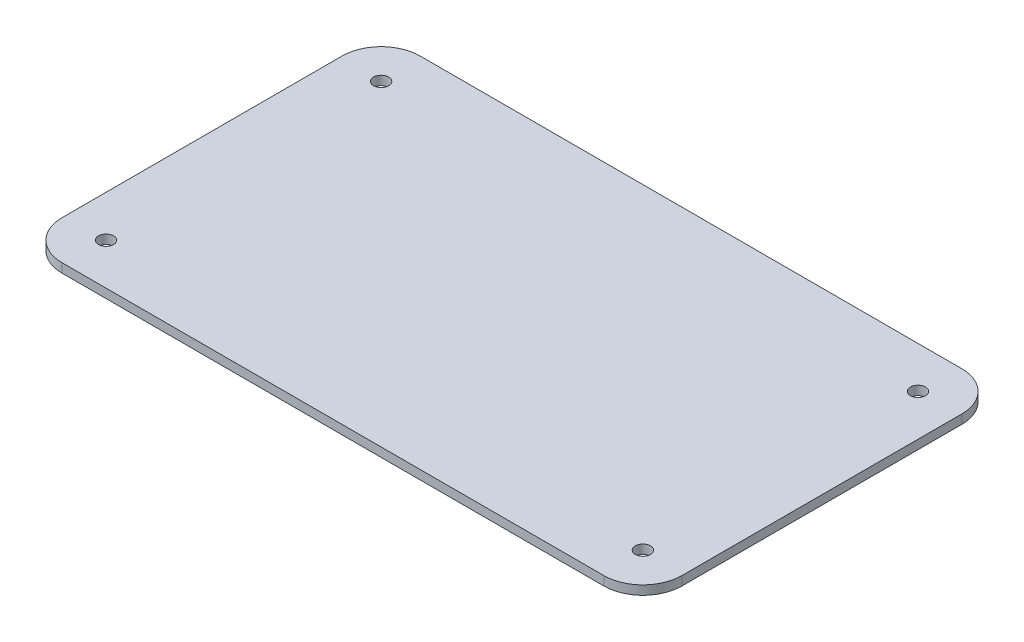
ISO-10303-21;
HEADER;
FILE_DESCRIPTION(('STEP AP214'),'2;1');
FILE_NAME('part.step','',(''),(''),'','','');
FILE_SCHEMA(('AUTOMOTIVE_DESIGN { 1 0 10303 214 1 1 1 1 }'));
ENDSEC;
DATA;
#1=APPLICATION_CONTEXT('core data for automotive mechanical design processes');
#2=APPLICATION_PROTOCOL_DEFINITION('international standard','automotive_design',2000,#1);
#3=PRODUCT_CONTEXT('',#1,'mechanical');
#4=PRODUCT('Part','Part','',(#3));
#5=PRODUCT_RELATED_PRODUCT_CATEGORY('part','',(#4));
#6=PRODUCT_DEFINITION_FORMATION('','',#4);
#7=PRODUCT_DEFINITION_CONTEXT('part definition',#1,'design');
#8=PRODUCT_DEFINITION('design','',#6,#7);
#9=PRODUCT_DEFINITION_SHAPE('','',#8);
#10=(LENGTH_UNIT() NAMED_UNIT(*) SI_UNIT(.MILLI.,.METRE.));
#11=(NAMED_UNIT(*) PLANE_ANGLE_UNIT() SI_UNIT($,.RADIAN.));
#12=(NAMED_UNIT(*) SI_UNIT($,.STERADIAN.) SOLID_ANGLE_UNIT());
#13=UNCERTAINTY_MEASURE_WITH_UNIT(LENGTH_MEASURE(1.E-05),#10,'distance_accuracy_value','');
#14=(GEOMETRIC_REPRESENTATION_CONTEXT(3) GLOBAL_UNCERTAINTY_ASSIGNED_CONTEXT((#13)) GLOBAL_UNIT_ASSIGNED_CONTEXT((#10,
#11,#12)) REPRESENTATION_CONTEXT('',''));
#15=CARTESIAN_POINT('',(0.,0.,0.));
#16=DIRECTION('',(0.,0.,1.));
#17=DIRECTION('',(1.,0.,0.));
#18=AXIS2_PLACEMENT_3D('',#15,#16,#17);
#19=CARTESIAN_POINT('',(89.7500000000001,3.,-46.385));
#20=DIRECTION('',(0.,-1.,0.));
#21=DIRECTION('',(0.,0.,-1.));
#22=AXIS2_PLACEMENT_3D('',#19,#20,#21);
#23=PLANE('',#22);
#24=CARTESIAN_POINT('',(89.7500000000001,3.,-46.385));
#25=DIRECTION('',(0.,1.,0.));
#26=DIRECTION('',(0.,0.,-1.));
#27=AXIS2_PLACEMENT_3D('',#24,#25,#26);
#28=CIRCLE('',#27,12.94);
#29=CARTESIAN_POINT('',(102.69,3.,-46.3849999999999));
#30=VERTEX_POINT('',#29);
#31=CARTESIAN_POINT('',(89.75,3.,-59.325));
#32=VERTEX_POINT('',#31);
#33=EDGE_CURVE('E164',#30,#32,#28,.T.);
#34=ORIENTED_EDGE('',*,*,#33,.T.);
#35=DIRECTION('',(-1.,0.,0.));
#36=VECTOR('',#35,1.);
#37=CARTESIAN_POINT('',(-89.7499999999999,3.,-59.325));
#38=LINE('',#37,#36);
#39=CARTESIAN_POINT('',(-89.7499999999999,3.,-59.325));
#40=VERTEX_POINT('',#39);
#41=EDGE_CURVE('E100',#32,#40,#38,.T.);
#42=ORIENTED_EDGE('',*,*,#41,.T.);
#43=CARTESIAN_POINT('',(-89.75,3.,-46.385));
#44=DIRECTION('',(0.,1.,0.));
#45=DIRECTION('',(0.,0.,-1.));
#46=AXIS2_PLACEMENT_3D('',#43,#44,#45);
#47=CIRCLE('',#46,12.94);
#48=CARTESIAN_POINT('',(-102.69,3.,-46.3849999999999));
#49=VERTEX_POINT('',#48);
#50=EDGE_CURVE('E185',#40,#49,#47,.T.);
#51=ORIENTED_EDGE('',*,*,#50,.T.);
#52=DIRECTION('',(0.,0.,1.));
#53=VECTOR('',#52,1.);
#54=CARTESIAN_POINT('',(-102.69,3.,46.3849999999999));
#55=LINE('',#54,#53);
#56=CARTESIAN_POINT('',(-102.69,3.,46.3849999999999));
#57=VERTEX_POINT('',#56);
#58=EDGE_CURVE('E199',#49,#57,#55,.T.);
#59=ORIENTED_EDGE('',*,*,#58,.T.);
#60=CARTESIAN_POINT('',(-89.75,3.,46.385));
#61=DIRECTION('',(0.,1.,0.));
#62=DIRECTION('',(0.,0.,-1.));
#63=AXIS2_PLACEMENT_3D('',#60,#61,#62);
#64=CIRCLE('',#63,12.94);
#65=CARTESIAN_POINT('',(-89.7499999999999,3.,59.325));
#66=VERTEX_POINT('',#65);
#67=EDGE_CURVE('E119',#57,#66,#64,.T.);
#68=ORIENTED_EDGE('',*,*,#67,.T.);
#69=DIRECTION('',(1.,0.,0.));
#70=VECTOR('',#69,1.);
#71=CARTESIAN_POINT('',(-89.7499999999999,3.,59.325));
#72=LINE('',#71,#70);
#73=CARTESIAN_POINT('',(89.75,3.,59.325));
#74=VERTEX_POINT('',#73);
#75=EDGE_CURVE('E113',#66,#74,#72,.T.);
#76=ORIENTED_EDGE('',*,*,#75,.T.);
#77=CARTESIAN_POINT('',(89.7500000000001,3.,46.385));
#78=DIRECTION('',(0.,1.,0.));
#79=DIRECTION('',(0.,0.,1.));
#80=AXIS2_PLACEMENT_3D('',#77,#78,#79);
#81=CIRCLE('',#80,12.94);
#82=CARTESIAN_POINT('',(102.69,3.,46.3849999999999));
#83=VERTEX_POINT('',#82);
#84=EDGE_CURVE('E117',#74,#83,#81,.T.);
#85=ORIENTED_EDGE('',*,*,#84,.T.);
#86=DIRECTION('',(0.,0.,-1.));
#87=VECTOR('',#86,1.);
#88=CARTESIAN_POINT('',(102.69,3.,46.3849999999999));
#89=LINE('',#88,#87);
#90=EDGE_CURVE('E57',#83,#30,#89,.T.);
#91=ORIENTED_EDGE('',*,*,#90,.T.);
#92=EDGE_LOOP('',(#34,#42,#51,#59,#68,#76,#85,#91));
#93=FACE_BOUND('',#92,.T.);
#94=CARTESIAN_POINT('',(-88.94,3.,-45.575));
#95=DIRECTION('',(0.,1.,0.));
#96=DIRECTION('',(0.,0.,1.));
#97=AXIS2_PLACEMENT_3D('',#94,#95,#96);
#98=CIRCLE('',#97,2.5);
#99=CARTESIAN_POINT('',(-88.94,3.,-43.075));
#100=VERTEX_POINT('',#99);
#101=EDGE_CURVE('E146',#100,#100,#98,.T.);
#102=ORIENTED_EDGE('',*,*,#101,.F.);
#103=EDGE_LOOP('',(#102));
#104=FACE_BOUND('',#103,.T.);
#105=CARTESIAN_POINT('',(88.94,3.,-45.575));
#106=DIRECTION('',(0.,1.,0.));
#107=DIRECTION('',(0.,0.,-1.));
#108=AXIS2_PLACEMENT_3D('',#105,#106,#107);
#109=CIRCLE('',#108,2.5);
#110=CARTESIAN_POINT('',(88.94,3.,-48.075));
#111=VERTEX_POINT('',#110);
#112=EDGE_CURVE('E213',#111,#111,#109,.T.);
#113=ORIENTED_EDGE('',*,*,#112,.F.);
#114=EDGE_LOOP('',(#113));
#115=FACE_BOUND('',#114,.T.);
#116=CARTESIAN_POINT('',(88.94,3.,45.575));
#117=DIRECTION('',(0.,1.,0.));
#118=DIRECTION('',(0.,0.,1.));
#119=AXIS2_PLACEMENT_3D('',#116,#117,#118);
#120=CIRCLE('',#119,2.5);
#121=CARTESIAN_POINT('',(88.94,3.,48.075));
#122=VERTEX_POINT('',#121);
#123=EDGE_CURVE('E221',#122,#122,#120,.T.);
#124=ORIENTED_EDGE('',*,*,#123,.F.);
#125=EDGE_LOOP('',(#124));
#126=FACE_BOUND('',#125,.T.);
#127=CARTESIAN_POINT('',(-88.94,3.,45.575));
#128=DIRECTION('',(0.,1.,0.));
#129=DIRECTION('',(0.,0.,-1.));
#130=AXIS2_PLACEMENT_3D('',#127,#128,#129);
#131=CIRCLE('',#130,2.5);
#132=CARTESIAN_POINT('',(-88.94,3.,43.075));
#133=VERTEX_POINT('',#132);
#134=EDGE_CURVE('E229',#133,#133,#131,.T.);
#135=ORIENTED_EDGE('',*,*,#134,.F.);
#136=EDGE_LOOP('',(#135));
#137=FACE_BOUND('',#136,.T.);
#138=ADVANCED_FACE('F39',(#93,#104,#115,#126,#137),#23,.F.);
#139=CARTESIAN_POINT('',(89.7500000000001,0.,-46.385));
#140=DIRECTION('',(0.,-1.,0.));
#141=DIRECTION('',(0.,0.,-1.));
#142=AXIS2_PLACEMENT_3D('',#139,#140,#141);
#143=PLANE('',#142);
#144=CARTESIAN_POINT('',(88.94,0.,45.575));
#145=DIRECTION('',(0.,1.,0.));
#146=DIRECTION('',(0.,0.,1.));
#147=AXIS2_PLACEMENT_3D('',#144,#145,#146);
#148=CIRCLE('',#147,2.5);
#149=CARTESIAN_POINT('',(88.94,0.,48.075));
#150=VERTEX_POINT('',#149);
#151=EDGE_CURVE('E225',#150,#150,#148,.T.);
#152=ORIENTED_EDGE('',*,*,#151,.T.);
#153=EDGE_LOOP('',(#152));
#154=FACE_BOUND('',#153,.T.);
#155=CARTESIAN_POINT('',(-88.94,0.,-45.575));
#156=DIRECTION('',(0.,1.,0.));
#157=DIRECTION('',(0.,0.,1.));
#158=AXIS2_PLACEMENT_3D('',#155,#156,#157);
#159=CIRCLE('',#158,2.5);
#160=CARTESIAN_POINT('',(-88.94,0.,-43.075));
#161=VERTEX_POINT('',#160);
#162=EDGE_CURVE('E209',#161,#161,#159,.T.);
#163=ORIENTED_EDGE('',*,*,#162,.T.);
#164=EDGE_LOOP('',(#163));
#165=FACE_BOUND('',#164,.T.);
#166=CARTESIAN_POINT('',(89.7500000000001,0.,-46.385));
#167=DIRECTION('',(0.,1.,0.));
#168=DIRECTION('',(0.,0.,-1.));
#169=AXIS2_PLACEMENT_3D('',#166,#167,#168);
#170=CIRCLE('',#169,12.94);
#171=CARTESIAN_POINT('',(102.69,0.,-46.3849999999999));
#172=VERTEX_POINT('',#171);
#173=CARTESIAN_POINT('',(89.75,0.,-59.325));
#174=VERTEX_POINT('',#173);
#175=EDGE_CURVE('E141',#172,#174,#170,.T.);
#176=ORIENTED_EDGE('',*,*,#175,.F.);
#177=DIRECTION('',(0.,0.,-1.));
#178=VECTOR('',#177,1.);
#179=CARTESIAN_POINT('',(102.69,0.,46.3849999999999));
#180=LINE('',#179,#178);
#181=CARTESIAN_POINT('',(102.69,0.,46.3849999999999));
#182=VERTEX_POINT('',#181);
#183=EDGE_CURVE('E92',#182,#172,#180,.T.);
#184=ORIENTED_EDGE('',*,*,#183,.F.);
#185=CARTESIAN_POINT('',(89.7500000000001,0.,46.385));
#186=DIRECTION('',(0.,1.,0.));
#187=DIRECTION('',(0.,0.,1.));
#188=AXIS2_PLACEMENT_3D('',#185,#186,#187);
#189=CIRCLE('',#188,12.94);
#190=CARTESIAN_POINT('',(89.75,0.,59.325));
#191=VERTEX_POINT('',#190);
#192=EDGE_CURVE('E86',#191,#182,#189,.T.);
#193=ORIENTED_EDGE('',*,*,#192,.F.);
#194=DIRECTION('',(1.,0.,0.));
#195=VECTOR('',#194,1.);
#196=CARTESIAN_POINT('',(-89.7499999999999,0.,59.325));
#197=LINE('',#196,#195);
#198=CARTESIAN_POINT('',(-89.7499999999999,0.,59.325));
#199=VERTEX_POINT('',#198);
#200=EDGE_CURVE('E128',#199,#191,#197,.T.);
#201=ORIENTED_EDGE('',*,*,#200,.F.);
#202=CARTESIAN_POINT('',(-89.75,0.,46.385));
#203=DIRECTION('',(0.,1.,0.));
#204=DIRECTION('',(0.,0.,-1.));
#205=AXIS2_PLACEMENT_3D('',#202,#203,#204);
#206=CIRCLE('',#205,12.94);
#207=CARTESIAN_POINT('',(-102.69,0.,46.3849999999999));
#208=VERTEX_POINT('',#207);
#209=EDGE_CURVE('E155',#208,#199,#206,.T.);
#210=ORIENTED_EDGE('',*,*,#209,.F.);
#211=DIRECTION('',(0.,0.,1.));
#212=VECTOR('',#211,1.);
#213=CARTESIAN_POINT('',(-102.69,0.,46.3849999999999));
#214=LINE('',#213,#212);
#215=CARTESIAN_POINT('',(-102.69,0.,-46.3849999999999));
#216=VERTEX_POINT('',#215);
#217=EDGE_CURVE('E152',#216,#208,#214,.T.);
#218=ORIENTED_EDGE('',*,*,#217,.F.);
#219=CARTESIAN_POINT('',(-89.75,0.,-46.385));
#220=DIRECTION('',(0.,1.,0.));
#221=DIRECTION('',(0.,0.,-1.));
#222=AXIS2_PLACEMENT_3D('',#219,#220,#221);
#223=CIRCLE('',#222,12.94);
#224=CARTESIAN_POINT('',(-89.7499999999999,0.,-59.325));
#225=VERTEX_POINT('',#224);
#226=EDGE_CURVE('E149',#225,#216,#223,.T.);
#227=ORIENTED_EDGE('',*,*,#226,.F.);
#228=DIRECTION('',(-1.,0.,0.));
#229=VECTOR('',#228,1.);
#230=CARTESIAN_POINT('',(-89.7499999999999,0.,-59.325));
#231=LINE('',#230,#229);
#232=EDGE_CURVE('E145',#174,#225,#231,.T.);
#233=ORIENTED_EDGE('',*,*,#232,.F.);
#234=EDGE_LOOP('',(#176,#184,#193,#201,#210,#218,#227,#233));
#235=FACE_BOUND('',#234,.T.);
#236=CARTESIAN_POINT('',(88.94,0.,-45.575));
#237=DIRECTION('',(0.,1.,0.));
#238=DIRECTION('',(0.,0.,-1.));
#239=AXIS2_PLACEMENT_3D('',#236,#237,#238);
#240=CIRCLE('',#239,2.5);
#241=CARTESIAN_POINT('',(88.94,0.,-48.075));
#242=VERTEX_POINT('',#241);
#243=EDGE_CURVE('E217',#242,#242,#240,.T.);
#244=ORIENTED_EDGE('',*,*,#243,.T.);
#245=EDGE_LOOP('',(#244));
#246=FACE_BOUND('',#245,.T.);
#247=CARTESIAN_POINT('',(-88.94,0.,45.575));
#248=DIRECTION('',(0.,1.,0.));
#249=DIRECTION('',(0.,0.,-1.));
#250=AXIS2_PLACEMENT_3D('',#247,#248,#249);
#251=CIRCLE('',#250,2.5);
#252=CARTESIAN_POINT('',(-88.94,0.,43.075));
#253=VERTEX_POINT('',#252);
#254=EDGE_CURVE('E233',#253,#253,#251,.T.);
#255=ORIENTED_EDGE('',*,*,#254,.T.);
#256=EDGE_LOOP('',(#255));
#257=FACE_BOUND('',#256,.T.);
#258=ADVANCED_FACE('F189',(#154,#165,#235,#246,#257),#143,.T.);
#259=CARTESIAN_POINT('',(89.7500000000001,3.,-46.385));
#260=DIRECTION('',(0.,-1.,0.));
#261=DIRECTION('',(0.,0.,-1.));
#262=AXIS2_PLACEMENT_3D('',#259,#260,#261);
#263=CYLINDRICAL_SURFACE('',#262,12.94);
#264=ORIENTED_EDGE('',*,*,#175,.T.);
#265=DIRECTION('',(0.,-1.,0.));
#266=VECTOR('',#265,1.);
#267=CARTESIAN_POINT('',(89.75,3.,-59.325));
#268=LINE('',#267,#266);
#269=EDGE_CURVE('E11',#32,#174,#268,.T.);
#270=ORIENTED_EDGE('',*,*,#269,.F.);
#271=ORIENTED_EDGE('',*,*,#33,.F.);
#272=DIRECTION('',(0.,-1.,0.));
#273=VECTOR('',#272,1.);
#274=CARTESIAN_POINT('',(102.69,3.,-46.3849999999999));
#275=LINE('',#274,#273);
#276=EDGE_CURVE('E137',#30,#172,#275,.T.);
#277=ORIENTED_EDGE('',*,*,#276,.T.);
#278=EDGE_LOOP('',(#264,#270,#271,#277));
#279=FACE_BOUND('',#278,.T.);
#280=ADVANCED_FACE('F41',(#279),#263,.T.);
#281=CARTESIAN_POINT('',(-89.7499999999999,3.,-59.325));
#282=DIRECTION('',(0.,0.,1.));
#283=DIRECTION('',(1.,0.,0.));
#284=AXIS2_PLACEMENT_3D('',#281,#282,#283);
#285=PLANE('',#284);
#286=ORIENTED_EDGE('',*,*,#232,.T.);
#287=DIRECTION('',(0.,-1.,0.));
#288=VECTOR('',#287,1.);
#289=CARTESIAN_POINT('',(-89.7499999999999,3.,-59.325));
#290=LINE('',#289,#288);
#291=EDGE_CURVE('E49',#40,#225,#290,.T.);
#292=ORIENTED_EDGE('',*,*,#291,.F.);
#293=ORIENTED_EDGE('',*,*,#41,.F.);
#294=ORIENTED_EDGE('',*,*,#269,.T.);
#295=EDGE_LOOP('',(#286,#292,#293,#294));
#296=FACE_BOUND('',#295,.T.);
#297=ADVANCED_FACE('F267',(#296),#285,.F.);
#298=CARTESIAN_POINT('',(-89.75,3.,-46.385));
#299=DIRECTION('',(0.,-1.,0.));
#300=DIRECTION('',(0.,0.,-1.));
#301=AXIS2_PLACEMENT_3D('',#298,#299,#300);
#302=CYLINDRICAL_SURFACE('',#301,12.94);
#303=ORIENTED_EDGE('',*,*,#226,.T.);
#304=DIRECTION('',(0.,-1.,0.));
#305=VECTOR('',#304,1.);
#306=CARTESIAN_POINT('',(-102.69,3.,-46.3849999999999));
#307=LINE('',#306,#305);
#308=EDGE_CURVE('E175',#49,#216,#307,.T.);
#309=ORIENTED_EDGE('',*,*,#308,.F.);
#310=ORIENTED_EDGE('',*,*,#50,.F.);
#311=ORIENTED_EDGE('',*,*,#291,.T.);
#312=EDGE_LOOP('',(#303,#309,#310,#311));
#313=FACE_BOUND('',#312,.T.);
#314=ADVANCED_FACE('F183',(#313),#302,.T.);
#315=CARTESIAN_POINT('',(-102.69,3.,46.3849999999999));
#316=DIRECTION('',(1.,0.,0.));
#317=DIRECTION('',(0.,0.,-1.));
#318=AXIS2_PLACEMENT_3D('',#315,#316,#317);
#319=PLANE('',#318);
#320=ORIENTED_EDGE('',*,*,#217,.T.);
#321=DIRECTION('',(0.,-1.,0.));
#322=VECTOR('',#321,1.);
#323=CARTESIAN_POINT('',(-102.69,3.,46.3849999999999));
#324=LINE('',#323,#322);
#325=EDGE_CURVE('E171',#57,#208,#324,.T.);
#326=ORIENTED_EDGE('',*,*,#325,.F.);
#327=ORIENTED_EDGE('',*,*,#58,.F.);
#328=ORIENTED_EDGE('',*,*,#308,.T.);
#329=EDGE_LOOP('',(#320,#326,#327,#328));
#330=FACE_BOUND('',#329,.T.);
#331=ADVANCED_FACE('F194',(#330),#319,.F.);
#332=CARTESIAN_POINT('',(-89.75,3.,46.385));
#333=DIRECTION('',(0.,-1.,0.));
#334=DIRECTION('',(0.,0.,-1.));
#335=AXIS2_PLACEMENT_3D('',#332,#333,#334);
#336=CYLINDRICAL_SURFACE('',#335,12.94);
#337=ORIENTED_EDGE('',*,*,#209,.T.);
#338=DIRECTION('',(0.,-1.,0.));
#339=VECTOR('',#338,1.);
#340=CARTESIAN_POINT('',(-89.7499999999999,3.,59.325));
#341=LINE('',#340,#339);
#342=EDGE_CURVE('E130',#66,#199,#341,.T.);
#343=ORIENTED_EDGE('',*,*,#342,.F.);
#344=ORIENTED_EDGE('',*,*,#67,.F.);
#345=ORIENTED_EDGE('',*,*,#325,.T.);
#346=EDGE_LOOP('',(#337,#343,#344,#345));
#347=FACE_BOUND('',#346,.T.);
#348=ADVANCED_FACE('F197',(#347),#336,.T.);
#349=CARTESIAN_POINT('',(-89.7499999999999,3.,59.325));
#350=DIRECTION('',(0.,0.,-1.));
#351=DIRECTION('',(-1.,0.,0.));
#352=AXIS2_PLACEMENT_3D('',#349,#350,#351);
#353=PLANE('',#352);
#354=ORIENTED_EDGE('',*,*,#200,.T.);
#355=DIRECTION('',(0.,-1.,0.));
#356=VECTOR('',#355,1.);
#357=CARTESIAN_POINT('',(89.75,3.,59.325));
#358=LINE('',#357,#356);
#359=EDGE_CURVE('E125',#74,#191,#358,.T.);
#360=ORIENTED_EDGE('',*,*,#359,.F.);
#361=ORIENTED_EDGE('',*,*,#75,.F.);
#362=ORIENTED_EDGE('',*,*,#342,.T.);
#363=EDGE_LOOP('',(#354,#360,#361,#362));
#364=FACE_BOUND('',#363,.T.);
#365=ADVANCED_FACE('F126',(#364),#353,.F.);
#366=CARTESIAN_POINT('',(89.7500000000001,3.,46.385));
#367=DIRECTION('',(0.,-1.,0.));
#368=DIRECTION('',(0.,0.,-1.));
#369=AXIS2_PLACEMENT_3D('',#366,#367,#368);
#370=CYLINDRICAL_SURFACE('',#369,12.94);
#371=ORIENTED_EDGE('',*,*,#192,.T.);
#372=DIRECTION('',(0.,-1.,0.));
#373=VECTOR('',#372,1.);
#374=CARTESIAN_POINT('',(102.69,3.,46.3849999999999));
#375=LINE('',#374,#373);
#376=EDGE_CURVE('E131',#83,#182,#375,.T.);
#377=ORIENTED_EDGE('',*,*,#376,.F.);
#378=ORIENTED_EDGE('',*,*,#84,.F.);
#379=ORIENTED_EDGE('',*,*,#359,.T.);
#380=EDGE_LOOP('',(#371,#377,#378,#379));
#381=FACE_BOUND('',#380,.T.);
#382=ADVANCED_FACE('F133',(#381),#370,.T.);
#383=CARTESIAN_POINT('',(102.69,3.,46.3849999999999));
#384=DIRECTION('',(-1.,0.,0.));
#385=DIRECTION('',(0.,0.,1.));
#386=AXIS2_PLACEMENT_3D('',#383,#384,#385);
#387=PLANE('',#386);
#388=ORIENTED_EDGE('',*,*,#183,.T.);
#389=ORIENTED_EDGE('',*,*,#276,.F.);
#390=ORIENTED_EDGE('',*,*,#90,.F.);
#391=ORIENTED_EDGE('',*,*,#376,.T.);
#392=EDGE_LOOP('',(#388,#389,#390,#391));
#393=FACE_BOUND('',#392,.T.);
#394=ADVANCED_FACE('F255',(#393),#387,.F.);
#395=CARTESIAN_POINT('',(-88.94,3.,-45.575));
#396=DIRECTION('',(0.,-1.,0.));
#397=DIRECTION('',(0.,0.,-1.));
#398=AXIS2_PLACEMENT_3D('',#395,#396,#397);
#399=CYLINDRICAL_SURFACE('',#398,2.5);
#400=ORIENTED_EDGE('',*,*,#101,.T.);
#401=EDGE_LOOP('',(#400));
#402=FACE_BOUND('',#401,.T.);
#403=ORIENTED_EDGE('',*,*,#162,.F.);
#404=EDGE_LOOP('',(#403));
#405=FACE_BOUND('',#404,.T.);
#406=ADVANCED_FACE('F252',(#402,#405),#399,.F.);
#407=CARTESIAN_POINT('',(88.94,3.,-45.575));
#408=DIRECTION('',(0.,-1.,0.));
#409=DIRECTION('',(0.,0.,-1.));
#410=AXIS2_PLACEMENT_3D('',#407,#408,#409);
#411=CYLINDRICAL_SURFACE('',#410,2.5);
#412=ORIENTED_EDGE('',*,*,#112,.T.);
#413=EDGE_LOOP('',(#412));
#414=FACE_BOUND('',#413,.T.);
#415=ORIENTED_EDGE('',*,*,#243,.F.);
#416=EDGE_LOOP('',(#415));
#417=FACE_BOUND('',#416,.T.);
#418=ADVANCED_FACE('F331',(#414,#417),#411,.F.);
#419=CARTESIAN_POINT('',(88.94,3.,45.575));
#420=DIRECTION('',(0.,-1.,0.));
#421=DIRECTION('',(0.,0.,-1.));
#422=AXIS2_PLACEMENT_3D('',#419,#420,#421);
#423=CYLINDRICAL_SURFACE('',#422,2.5);
#424=ORIENTED_EDGE('',*,*,#123,.T.);
#425=EDGE_LOOP('',(#424));
#426=FACE_BOUND('',#425,.T.);
#427=ORIENTED_EDGE('',*,*,#151,.F.);
#428=EDGE_LOOP('',(#427));
#429=FACE_BOUND('',#428,.T.);
#430=ADVANCED_FACE('F339',(#426,#429),#423,.F.);
#431=CARTESIAN_POINT('',(-88.94,3.,45.575));
#432=DIRECTION('',(0.,-1.,0.));
#433=DIRECTION('',(0.,0.,-1.));
#434=AXIS2_PLACEMENT_3D('',#431,#432,#433);
#435=CYLINDRICAL_SURFACE('',#434,2.5);
#436=ORIENTED_EDGE('',*,*,#134,.T.);
#437=EDGE_LOOP('',(#436));
#438=FACE_BOUND('',#437,.T.);
#439=ORIENTED_EDGE('',*,*,#254,.F.);
#440=EDGE_LOOP('',(#439));
#441=FACE_BOUND('',#440,.T.);
#442=ADVANCED_FACE('F241',(#438,#441),#435,.F.);
#443=CLOSED_SHELL('',(#138,#258,#280,#297,#314,#331,#348,#365,#382,#394,#406,#418,#430,#442));
#444=MANIFOLD_SOLID_BREP('B2',#443);
#445=ADVANCED_BREP_SHAPE_REPRESENTATION('',(#18,#444),#14);
#446=SHAPE_DEFINITION_REPRESENTATION(#9,#445);
ENDSEC;
END-ISO-10303-21;
